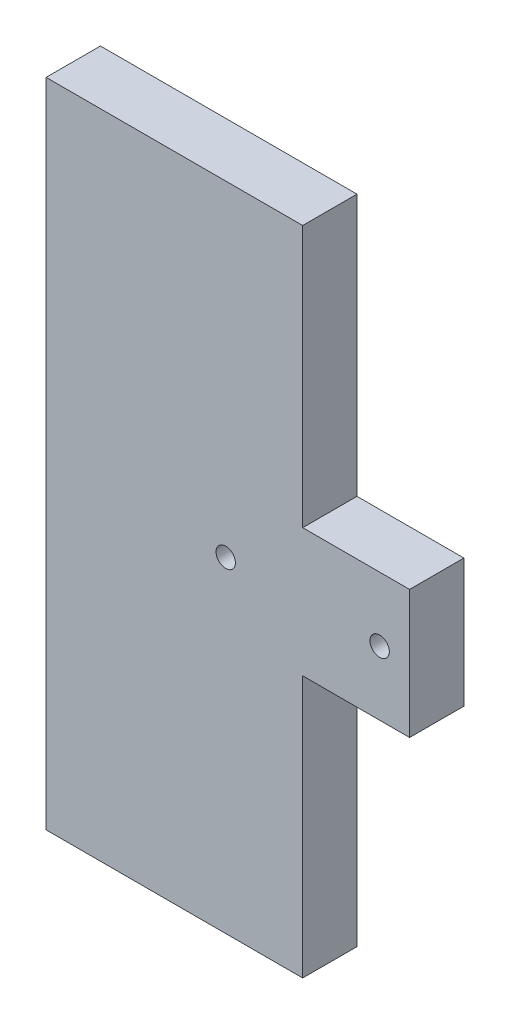
ISO-10303-21;
HEADER;
FILE_DESCRIPTION(('STEP AP214'),'2;1');
FILE_NAME('part.step','',(''),(''),'','','');
FILE_SCHEMA(('AUTOMOTIVE_DESIGN { 1 0 10303 214 1 1 1 1 }'));
ENDSEC;
DATA;
#1=APPLICATION_CONTEXT('core data for automotive mechanical design processes');
#2=APPLICATION_PROTOCOL_DEFINITION('international standard','automotive_design',2000,#1);
#3=PRODUCT_CONTEXT('',#1,'mechanical');
#4=PRODUCT('Part','Part','',(#3));
#5=PRODUCT_RELATED_PRODUCT_CATEGORY('part','',(#4));
#6=PRODUCT_DEFINITION_FORMATION('','',#4);
#7=PRODUCT_DEFINITION_CONTEXT('part definition',#1,'design');
#8=PRODUCT_DEFINITION('design','',#6,#7);
#9=PRODUCT_DEFINITION_SHAPE('','',#8);
#10=(LENGTH_UNIT() NAMED_UNIT(*) SI_UNIT(.MILLI.,.METRE.));
#11=(NAMED_UNIT(*) PLANE_ANGLE_UNIT() SI_UNIT($,.RADIAN.));
#12=(NAMED_UNIT(*) SI_UNIT($,.STERADIAN.) SOLID_ANGLE_UNIT());
#13=UNCERTAINTY_MEASURE_WITH_UNIT(LENGTH_MEASURE(1.E-05),#10,'distance_accuracy_value','');
#14=(GEOMETRIC_REPRESENTATION_CONTEXT(3) GLOBAL_UNCERTAINTY_ASSIGNED_CONTEXT((#13)) GLOBAL_UNIT_ASSIGNED_CONTEXT((#10,
#11,#12)) REPRESENTATION_CONTEXT('',''));
#15=CARTESIAN_POINT('',(0.,0.,0.));
#16=DIRECTION('',(0.,0.,1.));
#17=DIRECTION('',(1.,0.,0.));
#18=AXIS2_PLACEMENT_3D('',#15,#16,#17);
#19=CARTESIAN_POINT('',(0.,0.,6.35));
#20=DIRECTION('',(0.,0.,1.));
#21=DIRECTION('',(1.,0.,0.));
#22=AXIS2_PLACEMENT_3D('',#19,#20,#21);
#23=PLANE('',#22);
#24=CARTESIAN_POINT('',(-9.00000000000001,0.,6.35));
#25=DIRECTION('',(0.,0.,1.));
#26=DIRECTION('',(1.,0.,0.));
#27=AXIS2_PLACEMENT_3D('',#24,#25,#26);
#28=CIRCLE('',#27,1.1303);
#29=CARTESIAN_POINT('',(-7.86970000000001,0.,6.35));
#30=VERTEX_POINT('',#29);
#31=EDGE_CURVE('E150',#30,#30,#28,.T.);
#32=ORIENTED_EDGE('',*,*,#31,.F.);
#33=EDGE_LOOP('',(#32));
#34=FACE_BOUND('',#33,.T.);
#35=DIRECTION('',(1.,0.,0.));
#36=VECTOR('',#35,1.);
#37=CARTESIAN_POINT('',(12.5,-7.49999999999999,6.35));
#38=LINE('',#37,#36);
#39=CARTESIAN_POINT('',(0.,-7.49999999999999,6.35));
#40=VERTEX_POINT('',#39);
#41=CARTESIAN_POINT('',(12.5,-7.49999999999999,6.35));
#42=VERTEX_POINT('',#41);
#43=EDGE_CURVE('E168',#40,#42,#38,.T.);
#44=ORIENTED_EDGE('',*,*,#43,.T.);
#45=DIRECTION('',(0.,1.,0.));
#46=VECTOR('',#45,1.);
#47=CARTESIAN_POINT('',(12.5,7.49999999999999,6.35));
#48=LINE('',#47,#46);
#49=CARTESIAN_POINT('',(12.5,7.49999999999999,6.35));
#50=VERTEX_POINT('',#49);
#51=EDGE_CURVE('E104',#42,#50,#48,.T.);
#52=ORIENTED_EDGE('',*,*,#51,.T.);
#53=DIRECTION('',(-1.,0.,0.));
#54=VECTOR('',#53,1.);
#55=CARTESIAN_POINT('',(0.,7.49999999999999,6.35));
#56=LINE('',#55,#54);
#57=CARTESIAN_POINT('',(0.,7.49999999999999,6.35));
#58=VERTEX_POINT('',#57);
#59=EDGE_CURVE('E189',#50,#58,#56,.T.);
#60=ORIENTED_EDGE('',*,*,#59,.T.);
#61=DIRECTION('',(0.,1.,0.));
#62=VECTOR('',#61,1.);
#63=CARTESIAN_POINT('',(0.,38.1,6.35));
#64=LINE('',#63,#62);
#65=CARTESIAN_POINT('',(0.,38.1,6.35));
#66=VERTEX_POINT('',#65);
#67=EDGE_CURVE('E203',#58,#66,#64,.T.);
#68=ORIENTED_EDGE('',*,*,#67,.T.);
#69=DIRECTION('',(-1.,0.,0.));
#70=VECTOR('',#69,1.);
#71=CARTESIAN_POINT('',(-30.,38.1,6.35));
#72=LINE('',#71,#70);
#73=CARTESIAN_POINT('',(-30.,38.1,6.35));
#74=VERTEX_POINT('',#73);
#75=EDGE_CURVE('E123',#66,#74,#72,.T.);
#76=ORIENTED_EDGE('',*,*,#75,.T.);
#77=DIRECTION('',(0.,-1.,0.));
#78=VECTOR('',#77,1.);
#79=CARTESIAN_POINT('',(-30.,38.1,6.35));
#80=LINE('',#79,#78);
#81=CARTESIAN_POINT('',(-30.,-38.1,6.35));
#82=VERTEX_POINT('',#81);
#83=EDGE_CURVE('E117',#74,#82,#80,.T.);
#84=ORIENTED_EDGE('',*,*,#83,.T.);
#85=DIRECTION('',(1.,0.,0.));
#86=VECTOR('',#85,1.);
#87=CARTESIAN_POINT('',(-30.,-38.1,6.35));
#88=LINE('',#87,#86);
#89=CARTESIAN_POINT('',(0.,-38.1,6.35));
#90=VERTEX_POINT('',#89);
#91=EDGE_CURVE('E121',#82,#90,#88,.T.);
#92=ORIENTED_EDGE('',*,*,#91,.T.);
#93=DIRECTION('',(0.,1.,0.));
#94=VECTOR('',#93,1.);
#95=CARTESIAN_POINT('',(0.,-7.49999999999999,6.35));
#96=LINE('',#95,#94);
#97=EDGE_CURVE('E61',#90,#40,#96,.T.);
#98=ORIENTED_EDGE('',*,*,#97,.T.);
#99=EDGE_LOOP('',(#44,#52,#60,#68,#76,#84,#92,#98));
#100=FACE_BOUND('',#99,.T.);
#101=CARTESIAN_POINT('',(8.99999999999999,0.,6.35));
#102=DIRECTION('',(0.,0.,1.));
#103=DIRECTION('',(1.,0.,0.));
#104=AXIS2_PLACEMENT_3D('',#101,#102,#103);
#105=CIRCLE('',#104,1.1303);
#106=CARTESIAN_POINT('',(10.1303,0.,6.35));
#107=VERTEX_POINT('',#106);
#108=EDGE_CURVE('E217',#107,#107,#105,.T.);
#109=ORIENTED_EDGE('',*,*,#108,.F.);
#110=EDGE_LOOP('',(#109));
#111=FACE_BOUND('',#110,.T.);
#112=ADVANCED_FACE('F43',(#34,#100,#111),#23,.T.);
#113=CARTESIAN_POINT('',(0.,0.,0.));
#114=DIRECTION('',(0.,0.,1.));
#115=DIRECTION('',(1.,0.,0.));
#116=AXIS2_PLACEMENT_3D('',#113,#114,#115);
#117=PLANE('',#116);
#118=DIRECTION('',(1.,0.,0.));
#119=VECTOR('',#118,1.);
#120=CARTESIAN_POINT('',(12.5,-7.49999999999999,0.));
#121=LINE('',#120,#119);
#122=CARTESIAN_POINT('',(0.,-7.49999999999999,0.));
#123=VERTEX_POINT('',#122);
#124=CARTESIAN_POINT('',(12.5,-7.49999999999999,0.));
#125=VERTEX_POINT('',#124);
#126=EDGE_CURVE('E145',#123,#125,#121,.T.);
#127=ORIENTED_EDGE('',*,*,#126,.F.);
#128=DIRECTION('',(0.,1.,0.));
#129=VECTOR('',#128,1.);
#130=CARTESIAN_POINT('',(0.,-7.49999999999999,0.));
#131=LINE('',#130,#129);
#132=CARTESIAN_POINT('',(0.,-38.1,0.));
#133=VERTEX_POINT('',#132);
#134=EDGE_CURVE('E96',#133,#123,#131,.T.);
#135=ORIENTED_EDGE('',*,*,#134,.F.);
#136=DIRECTION('',(1.,0.,0.));
#137=VECTOR('',#136,1.);
#138=CARTESIAN_POINT('',(-30.,-38.1,0.));
#139=LINE('',#138,#137);
#140=CARTESIAN_POINT('',(-30.,-38.1,0.));
#141=VERTEX_POINT('',#140);
#142=EDGE_CURVE('E90',#141,#133,#139,.T.);
#143=ORIENTED_EDGE('',*,*,#142,.F.);
#144=DIRECTION('',(0.,-1.,0.));
#145=VECTOR('',#144,1.);
#146=CARTESIAN_POINT('',(-30.,38.1,0.));
#147=LINE('',#146,#145);
#148=CARTESIAN_POINT('',(-30.,38.1,0.));
#149=VERTEX_POINT('',#148);
#150=EDGE_CURVE('E132',#149,#141,#147,.T.);
#151=ORIENTED_EDGE('',*,*,#150,.F.);
#152=DIRECTION('',(-1.,0.,0.));
#153=VECTOR('',#152,1.);
#154=CARTESIAN_POINT('',(-30.,38.1,0.));
#155=LINE('',#154,#153);
#156=CARTESIAN_POINT('',(0.,38.1,0.));
#157=VERTEX_POINT('',#156);
#158=EDGE_CURVE('E159',#157,#149,#155,.T.);
#159=ORIENTED_EDGE('',*,*,#158,.F.);
#160=DIRECTION('',(0.,1.,0.));
#161=VECTOR('',#160,1.);
#162=CARTESIAN_POINT('',(0.,38.1,0.));
#163=LINE('',#162,#161);
#164=CARTESIAN_POINT('',(0.,7.49999999999999,0.));
#165=VERTEX_POINT('',#164);
#166=EDGE_CURVE('E156',#165,#157,#163,.T.);
#167=ORIENTED_EDGE('',*,*,#166,.F.);
#168=DIRECTION('',(-1.,0.,0.));
#169=VECTOR('',#168,1.);
#170=CARTESIAN_POINT('',(0.,7.49999999999999,0.));
#171=LINE('',#170,#169);
#172=CARTESIAN_POINT('',(12.5,7.49999999999999,0.));
#173=VERTEX_POINT('',#172);
#174=EDGE_CURVE('E153',#173,#165,#171,.T.);
#175=ORIENTED_EDGE('',*,*,#174,.F.);
#176=DIRECTION('',(0.,1.,0.));
#177=VECTOR('',#176,1.);
#178=CARTESIAN_POINT('',(12.5,7.49999999999999,0.));
#179=LINE('',#178,#177);
#180=EDGE_CURVE('E149',#125,#173,#179,.T.);
#181=ORIENTED_EDGE('',*,*,#180,.F.);
#182=EDGE_LOOP('',(#127,#135,#143,#151,#159,#167,#175,#181));
#183=FACE_BOUND('',#182,.T.);
#184=CARTESIAN_POINT('',(-9.00000000000001,0.,0.));
#185=DIRECTION('',(0.,0.,1.));
#186=DIRECTION('',(1.,0.,0.));
#187=AXIS2_PLACEMENT_3D('',#184,#185,#186);
#188=CIRCLE('',#187,1.1303);
#189=CARTESIAN_POINT('',(-7.86970000000001,0.,0.));
#190=VERTEX_POINT('',#189);
#191=EDGE_CURVE('E213',#190,#190,#188,.T.);
#192=ORIENTED_EDGE('',*,*,#191,.T.);
#193=EDGE_LOOP('',(#192));
#194=FACE_BOUND('',#193,.T.);
#195=CARTESIAN_POINT('',(8.99999999999999,0.,0.));
#196=DIRECTION('',(0.,0.,1.));
#197=DIRECTION('',(1.,0.,0.));
#198=AXIS2_PLACEMENT_3D('',#195,#196,#197);
#199=CIRCLE('',#198,1.1303);
#200=CARTESIAN_POINT('',(10.1303,0.,0.));
#201=VERTEX_POINT('',#200);
#202=EDGE_CURVE('E221',#201,#201,#199,.T.);
#203=ORIENTED_EDGE('',*,*,#202,.T.);
#204=EDGE_LOOP('',(#203));
#205=FACE_BOUND('',#204,.T.);
#206=ADVANCED_FACE('F193',(#183,#194,#205),#117,.F.);
#207=CARTESIAN_POINT('',(12.5,-7.49999999999999,6.35));
#208=DIRECTION('',(0.,1.,0.));
#209=DIRECTION('',(-1.,0.,0.));
#210=AXIS2_PLACEMENT_3D('',#207,#208,#209);
#211=PLANE('',#210);
#212=ORIENTED_EDGE('',*,*,#126,.T.);
#213=DIRECTION('',(0.,0.,-1.));
#214=VECTOR('',#213,1.);
#215=CARTESIAN_POINT('',(12.5,-7.49999999999999,6.35));
#216=LINE('',#215,#214);
#217=EDGE_CURVE('E11',#42,#125,#216,.T.);
#218=ORIENTED_EDGE('',*,*,#217,.F.);
#219=ORIENTED_EDGE('',*,*,#43,.F.);
#220=DIRECTION('',(0.,0.,-1.));
#221=VECTOR('',#220,1.);
#222=CARTESIAN_POINT('',(0.,-7.49999999999999,6.35));
#223=LINE('',#222,#221);
#224=EDGE_CURVE('E141',#40,#123,#223,.T.);
#225=ORIENTED_EDGE('',*,*,#224,.T.);
#226=EDGE_LOOP('',(#212,#218,#219,#225));
#227=FACE_BOUND('',#226,.T.);
#228=ADVANCED_FACE('F45',(#227),#211,.F.);
#229=CARTESIAN_POINT('',(12.5,7.49999999999999,6.35));
#230=DIRECTION('',(-1.,0.,0.));
#231=DIRECTION('',(0.,0.,1.));
#232=AXIS2_PLACEMENT_3D('',#229,#230,#231);
#233=PLANE('',#232);
#234=ORIENTED_EDGE('',*,*,#180,.T.);
#235=DIRECTION('',(0.,0.,-1.));
#236=VECTOR('',#235,1.);
#237=CARTESIAN_POINT('',(12.5,7.49999999999999,6.35));
#238=LINE('',#237,#236);
#239=EDGE_CURVE('E53',#50,#173,#238,.T.);
#240=ORIENTED_EDGE('',*,*,#239,.F.);
#241=ORIENTED_EDGE('',*,*,#51,.F.);
#242=ORIENTED_EDGE('',*,*,#217,.T.);
#243=EDGE_LOOP('',(#234,#240,#241,#242));
#244=FACE_BOUND('',#243,.T.);
#245=ADVANCED_FACE('F255',(#244),#233,.F.);
#246=CARTESIAN_POINT('',(0.,7.49999999999999,6.35));
#247=DIRECTION('',(0.,-1.,0.));
#248=DIRECTION('',(0.,0.,-1.));
#249=AXIS2_PLACEMENT_3D('',#246,#247,#248);
#250=PLANE('',#249);
#251=ORIENTED_EDGE('',*,*,#174,.T.);
#252=DIRECTION('',(0.,0.,-1.));
#253=VECTOR('',#252,1.);
#254=CARTESIAN_POINT('',(0.,7.49999999999999,6.35));
#255=LINE('',#254,#253);
#256=EDGE_CURVE('E179',#58,#165,#255,.T.);
#257=ORIENTED_EDGE('',*,*,#256,.F.);
#258=ORIENTED_EDGE('',*,*,#59,.F.);
#259=ORIENTED_EDGE('',*,*,#239,.T.);
#260=EDGE_LOOP('',(#251,#257,#258,#259));
#261=FACE_BOUND('',#260,.T.);
#262=ADVANCED_FACE('F187',(#261),#250,.F.);
#263=CARTESIAN_POINT('',(0.,38.1,6.35));
#264=DIRECTION('',(-1.,0.,0.));
#265=DIRECTION('',(0.,-1.,0.));
#266=AXIS2_PLACEMENT_3D('',#263,#264,#265);
#267=PLANE('',#266);
#268=ORIENTED_EDGE('',*,*,#166,.T.);
#269=DIRECTION('',(0.,0.,-1.));
#270=VECTOR('',#269,1.);
#271=CARTESIAN_POINT('',(0.,38.1,6.35));
#272=LINE('',#271,#270);
#273=EDGE_CURVE('E175',#66,#157,#272,.T.);
#274=ORIENTED_EDGE('',*,*,#273,.F.);
#275=ORIENTED_EDGE('',*,*,#67,.F.);
#276=ORIENTED_EDGE('',*,*,#256,.T.);
#277=EDGE_LOOP('',(#268,#274,#275,#276));
#278=FACE_BOUND('',#277,.T.);
#279=ADVANCED_FACE('F198',(#278),#267,.F.);
#280=CARTESIAN_POINT('',(-30.,38.1,6.35));
#281=DIRECTION('',(0.,-1.,0.));
#282=DIRECTION('',(0.,0.,-1.));
#283=AXIS2_PLACEMENT_3D('',#280,#281,#282);
#284=PLANE('',#283);
#285=ORIENTED_EDGE('',*,*,#158,.T.);
#286=DIRECTION('',(0.,0.,-1.));
#287=VECTOR('',#286,1.);
#288=CARTESIAN_POINT('',(-30.,38.1,6.35));
#289=LINE('',#288,#287);
#290=EDGE_CURVE('E134',#74,#149,#289,.T.);
#291=ORIENTED_EDGE('',*,*,#290,.F.);
#292=ORIENTED_EDGE('',*,*,#75,.F.);
#293=ORIENTED_EDGE('',*,*,#273,.T.);
#294=EDGE_LOOP('',(#285,#291,#292,#293));
#295=FACE_BOUND('',#294,.T.);
#296=ADVANCED_FACE('F201',(#295),#284,.F.);
#297=CARTESIAN_POINT('',(-30.,38.1,6.35));
#298=DIRECTION('',(1.,0.,0.));
#299=DIRECTION('',(0.,0.,-1.));
#300=AXIS2_PLACEMENT_3D('',#297,#298,#299);
#301=PLANE('',#300);
#302=ORIENTED_EDGE('',*,*,#150,.T.);
#303=DIRECTION('',(0.,0.,-1.));
#304=VECTOR('',#303,1.);
#305=CARTESIAN_POINT('',(-30.,-38.1,6.35));
#306=LINE('',#305,#304);
#307=EDGE_CURVE('E129',#82,#141,#306,.T.);
#308=ORIENTED_EDGE('',*,*,#307,.F.);
#309=ORIENTED_EDGE('',*,*,#83,.F.);
#310=ORIENTED_EDGE('',*,*,#290,.T.);
#311=EDGE_LOOP('',(#302,#308,#309,#310));
#312=FACE_BOUND('',#311,.T.);
#313=ADVANCED_FACE('F130',(#312),#301,.F.);
#314=CARTESIAN_POINT('',(-30.,-38.1,6.35));
#315=DIRECTION('',(0.,1.,0.));
#316=DIRECTION('',(0.,0.,1.));
#317=AXIS2_PLACEMENT_3D('',#314,#315,#316);
#318=PLANE('',#317);
#319=ORIENTED_EDGE('',*,*,#142,.T.);
#320=DIRECTION('',(0.,0.,-1.));
#321=VECTOR('',#320,1.);
#322=CARTESIAN_POINT('',(0.,-38.1,6.35));
#323=LINE('',#322,#321);
#324=EDGE_CURVE('E135',#90,#133,#323,.T.);
#325=ORIENTED_EDGE('',*,*,#324,.F.);
#326=ORIENTED_EDGE('',*,*,#91,.F.);
#327=ORIENTED_EDGE('',*,*,#307,.T.);
#328=EDGE_LOOP('',(#319,#325,#326,#327));
#329=FACE_BOUND('',#328,.T.);
#330=ADVANCED_FACE('F137',(#329),#318,.F.);
#331=CARTESIAN_POINT('',(0.,-7.49999999999999,6.35));
#332=DIRECTION('',(-1.,0.,0.));
#333=DIRECTION('',(0.,-1.,0.));
#334=AXIS2_PLACEMENT_3D('',#331,#332,#333);
#335=PLANE('',#334);
#336=ORIENTED_EDGE('',*,*,#134,.T.);
#337=ORIENTED_EDGE('',*,*,#224,.F.);
#338=ORIENTED_EDGE('',*,*,#97,.F.);
#339=ORIENTED_EDGE('',*,*,#324,.T.);
#340=EDGE_LOOP('',(#336,#337,#338,#339));
#341=FACE_BOUND('',#340,.T.);
#342=ADVANCED_FACE('F243',(#341),#335,.F.);
#343=CARTESIAN_POINT('',(-9.00000000000001,0.,6.35));
#344=DIRECTION('',(0.,0.,-1.));
#345=DIRECTION('',(-1.,0.,0.));
#346=AXIS2_PLACEMENT_3D('',#343,#344,#345);
#347=CYLINDRICAL_SURFACE('',#346,1.1303);
#348=ORIENTED_EDGE('',*,*,#31,.T.);
#349=EDGE_LOOP('',(#348));
#350=FACE_BOUND('',#349,.T.);
#351=ORIENTED_EDGE('',*,*,#191,.F.);
#352=EDGE_LOOP('',(#351));
#353=FACE_BOUND('',#352,.T.);
#354=ADVANCED_FACE('F240',(#350,#353),#347,.F.);
#355=CARTESIAN_POINT('',(8.99999999999999,0.,6.35));
#356=DIRECTION('',(0.,0.,-1.));
#357=DIRECTION('',(-1.,0.,0.));
#358=AXIS2_PLACEMENT_3D('',#355,#356,#357);
#359=CYLINDRICAL_SURFACE('',#358,1.1303);
#360=ORIENTED_EDGE('',*,*,#108,.T.);
#361=EDGE_LOOP('',(#360));
#362=FACE_BOUND('',#361,.T.);
#363=ORIENTED_EDGE('',*,*,#202,.F.);
#364=EDGE_LOOP('',(#363));
#365=FACE_BOUND('',#364,.T.);
#366=ADVANCED_FACE('F229',(#362,#365),#359,.F.);
#367=CLOSED_SHELL('',(#112,#206,#228,#245,#262,#279,#296,#313,#330,#342,#354,#366));
#368=MANIFOLD_SOLID_BREP('B2',#367);
#369=ADVANCED_BREP_SHAPE_REPRESENTATION('',(#18,#368),#14);
#370=SHAPE_DEFINITION_REPRESENTATION(#9,#369);
ENDSEC;
END-ISO-10303-21;
